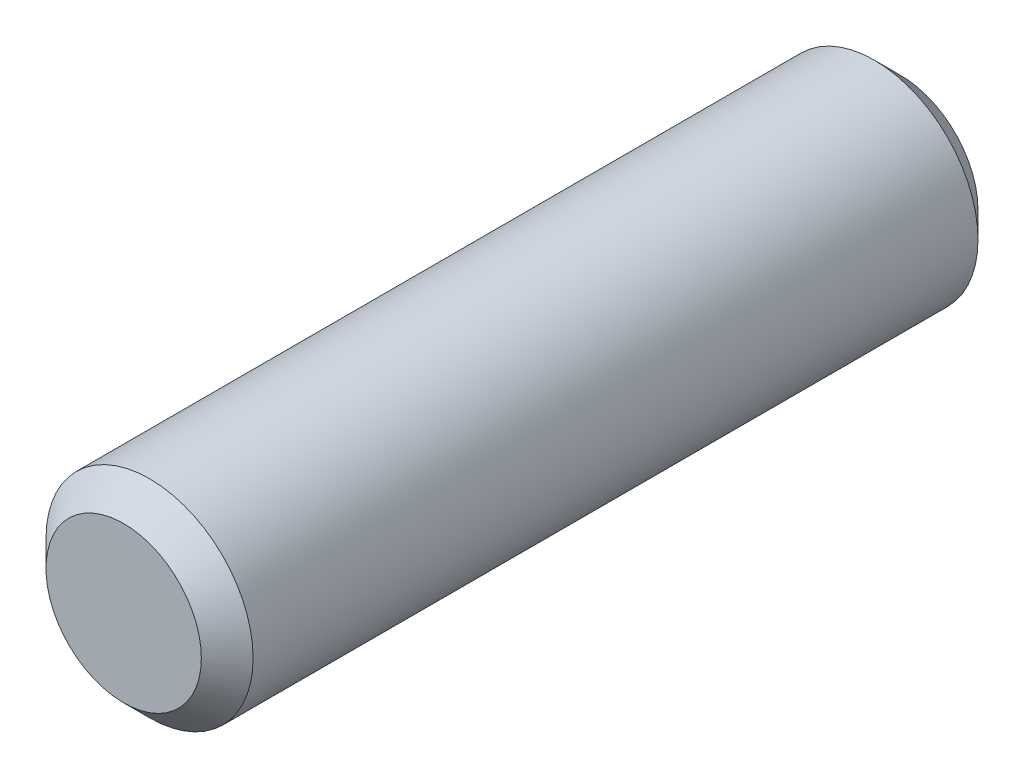
ISO-10303-21;
HEADER;
FILE_DESCRIPTION(('STEP AP214'),'2;1');
FILE_NAME('part.step','',(''),(''),'','','');
FILE_SCHEMA(('AUTOMOTIVE_DESIGN { 1 0 10303 214 1 1 1 1 }'));
ENDSEC;
DATA;
#1=APPLICATION_CONTEXT('core data for automotive mechanical design processes');
#2=APPLICATION_PROTOCOL_DEFINITION('international standard','automotive_design',2000,#1);
#3=PRODUCT_CONTEXT('',#1,'mechanical');
#4=PRODUCT('Part','Part','',(#3));
#5=PRODUCT_RELATED_PRODUCT_CATEGORY('part','',(#4));
#6=PRODUCT_DEFINITION_FORMATION('','',#4);
#7=PRODUCT_DEFINITION_CONTEXT('part definition',#1,'design');
#8=PRODUCT_DEFINITION('design','',#6,#7);
#9=PRODUCT_DEFINITION_SHAPE('','',#8);
#10=(LENGTH_UNIT() NAMED_UNIT(*) SI_UNIT(.MILLI.,.METRE.));
#11=(NAMED_UNIT(*) PLANE_ANGLE_UNIT() SI_UNIT($,.RADIAN.));
#12=(NAMED_UNIT(*) SI_UNIT($,.STERADIAN.) SOLID_ANGLE_UNIT());
#13=UNCERTAINTY_MEASURE_WITH_UNIT(LENGTH_MEASURE(1.E-05),#10,'distance_accuracy_value','');
#14=(GEOMETRIC_REPRESENTATION_CONTEXT(3) GLOBAL_UNCERTAINTY_ASSIGNED_CONTEXT((#13)) GLOBAL_UNIT_ASSIGNED_CONTEXT((#10,
#11,#12)) REPRESENTATION_CONTEXT('',''));
#15=CARTESIAN_POINT('',(0.,0.,0.));
#16=DIRECTION('',(0.,0.,1.));
#17=DIRECTION('',(1.,0.,0.));
#18=AXIS2_PLACEMENT_3D('',#15,#16,#17);
#19=CARTESIAN_POINT('',(0.,0.,7.5));
#20=DIRECTION('',(0.,0.,-1.));
#21=DIRECTION('',(-1.,0.,0.));
#22=AXIS2_PLACEMENT_3D('',#19,#20,#21);
#23=CYLINDRICAL_SURFACE('',#22,1.);
#24=CARTESIAN_POINT('',(0.,0.,0.250000000000001));
#25=DIRECTION('',(0.,0.,1.));
#26=DIRECTION('',(1.,0.,0.));
#27=AXIS2_PLACEMENT_3D('',#24,#25,#26);
#28=CIRCLE('',#27,1.);
#29=CARTESIAN_POINT('',(1.,0.,0.250000000000001));
#30=VERTEX_POINT('',#29);
#31=EDGE_CURVE('E51',#30,#30,#28,.T.);
#32=ORIENTED_EDGE('',*,*,#31,.T.);
#33=EDGE_LOOP('',(#32));
#34=FACE_BOUND('',#33,.T.);
#35=CARTESIAN_POINT('',(0.,0.,7.25));
#36=DIRECTION('',(0.,0.,1.));
#37=DIRECTION('',(1.,0.,0.));
#38=AXIS2_PLACEMENT_3D('',#35,#36,#37);
#39=CIRCLE('',#38,1.);
#40=CARTESIAN_POINT('',(1.,0.,7.25));
#41=VERTEX_POINT('',#40);
#42=EDGE_CURVE('E55',#41,#41,#39,.F.);
#43=ORIENTED_EDGE('',*,*,#42,.T.);
#44=EDGE_LOOP('',(#43));
#45=FACE_BOUND('',#44,.T.);
#46=ADVANCED_FACE('F39',(#34,#45),#23,.T.);
#47=CARTESIAN_POINT('',(0.,0.,7.5));
#48=DIRECTION('',(0.,0.,1.));
#49=DIRECTION('',(1.,0.,0.));
#50=AXIS2_PLACEMENT_3D('',#47,#48,#49);
#51=PLANE('',#50);
#52=CARTESIAN_POINT('',(0.,0.,7.5));
#53=DIRECTION('',(0.,0.,1.));
#54=DIRECTION('',(1.,0.,0.));
#55=AXIS2_PLACEMENT_3D('',#52,#53,#54);
#56=CIRCLE('',#55,0.749999999999998);
#57=CARTESIAN_POINT('',(0.749999999999998,0.,7.5));
#58=VERTEX_POINT('',#57);
#59=EDGE_CURVE('E10',#58,#58,#56,.T.);
#60=ORIENTED_EDGE('',*,*,#59,.T.);
#61=EDGE_LOOP('',(#60));
#62=FACE_BOUND('',#61,.T.);
#63=ADVANCED_FACE('F71',(#62),#51,.T.);
#64=CARTESIAN_POINT('',(0.,0.,0.));
#65=DIRECTION('',(0.,0.,1.));
#66=DIRECTION('',(1.,0.,0.));
#67=AXIS2_PLACEMENT_3D('',#64,#65,#66);
#68=PLANE('',#67);
#69=CARTESIAN_POINT('',(0.,0.,0.));
#70=DIRECTION('',(0.,0.,1.));
#71=DIRECTION('',(1.,0.,0.));
#72=AXIS2_PLACEMENT_3D('',#69,#70,#71);
#73=CIRCLE('',#72,0.749999999999999);
#74=CARTESIAN_POINT('',(0.749999999999999,0.,0.));
#75=VERTEX_POINT('',#74);
#76=EDGE_CURVE('E47',#75,#75,#73,.F.);
#77=ORIENTED_EDGE('',*,*,#76,.T.);
#78=EDGE_LOOP('',(#77));
#79=FACE_BOUND('',#78,.T.);
#80=ADVANCED_FACE('F68',(#79),#68,.F.);
#81=CARTESIAN_POINT('',(0.,0.,0.250000000000001));
#82=DIRECTION('',(0.,0.,1.));
#83=DIRECTION('',(1.,0.,0.));
#84=AXIS2_PLACEMENT_3D('',#81,#82,#83);
#85=CONICAL_SURFACE('',#84,1.,0.785398163397449);
#86=ORIENTED_EDGE('',*,*,#76,.F.);
#87=EDGE_LOOP('',(#86));
#88=FACE_BOUND('',#87,.T.);
#89=ORIENTED_EDGE('',*,*,#31,.F.);
#90=EDGE_LOOP('',(#89));
#91=FACE_BOUND('',#90,.T.);
#92=ADVANCED_FACE('F64',(#88,#91),#85,.T.);
#93=CARTESIAN_POINT('',(0.,0.,7.5));
#94=DIRECTION('',(0.,0.,-1.));
#95=DIRECTION('',(-1.,0.,0.));
#96=AXIS2_PLACEMENT_3D('',#93,#94,#95);
#97=CONICAL_SURFACE('',#96,0.749999999999998,0.785398163397447);
#98=ORIENTED_EDGE('',*,*,#42,.F.);
#99=EDGE_LOOP('',(#98));
#100=FACE_BOUND('',#99,.T.);
#101=ORIENTED_EDGE('',*,*,#59,.F.);
#102=EDGE_LOOP('',(#101));
#103=FACE_BOUND('',#102,.T.);
#104=ADVANCED_FACE('F42',(#100,#103),#97,.T.);
#105=CLOSED_SHELL('',(#46,#63,#80,#92,#104));
#106=MANIFOLD_SOLID_BREP('B2',#105);
#107=ADVANCED_BREP_SHAPE_REPRESENTATION('',(#18,#106),#14);
#108=SHAPE_DEFINITION_REPRESENTATION(#9,#107);
ENDSEC;
END-ISO-10303-21;
